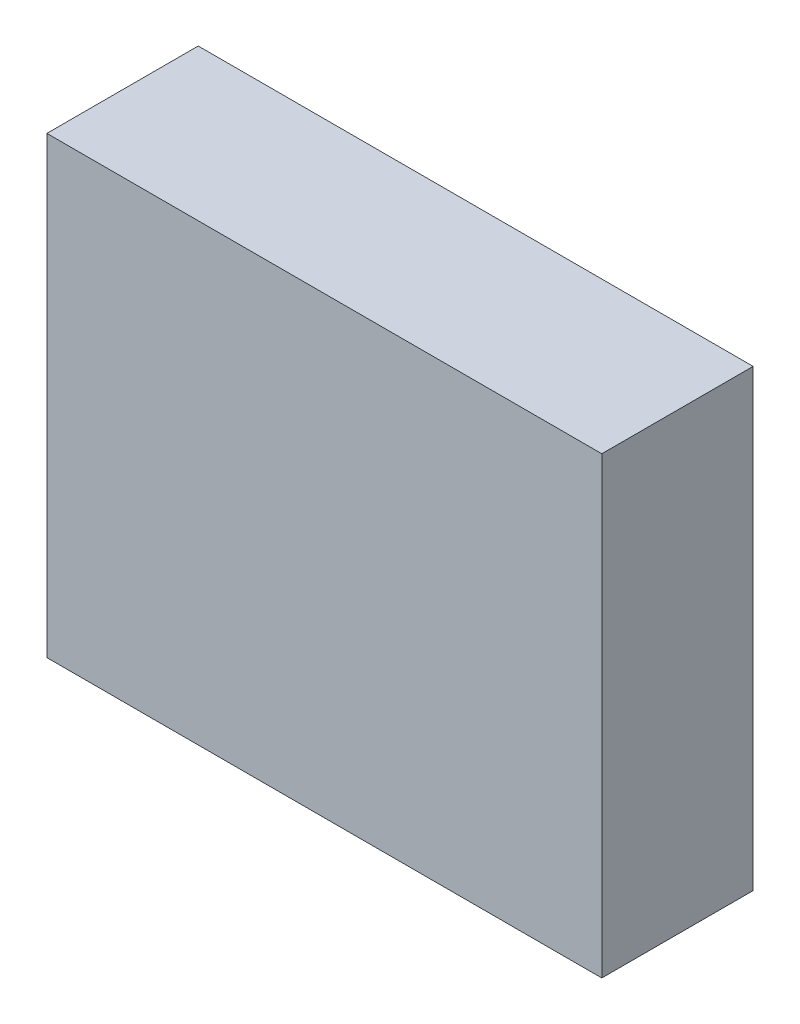
ISO-10303-21;
HEADER;
FILE_DESCRIPTION(('STEP AP214'),'2;1');
FILE_NAME('part.step','',(''),(''),'','','');
FILE_SCHEMA(('AUTOMOTIVE_DESIGN { 1 0 10303 214 1 1 1 1 }'));
ENDSEC;
DATA;
#1=APPLICATION_CONTEXT('core data for automotive mechanical design processes');
#2=APPLICATION_PROTOCOL_DEFINITION('international standard','automotive_design',2000,#1);
#3=PRODUCT_CONTEXT('',#1,'mechanical');
#4=PRODUCT('Part','Part','',(#3));
#5=PRODUCT_RELATED_PRODUCT_CATEGORY('part','',(#4));
#6=PRODUCT_DEFINITION_FORMATION('','',#4);
#7=PRODUCT_DEFINITION_CONTEXT('part definition',#1,'design');
#8=PRODUCT_DEFINITION('design','',#6,#7);
#9=PRODUCT_DEFINITION_SHAPE('','',#8);
#10=(LENGTH_UNIT() NAMED_UNIT(*) SI_UNIT(.MILLI.,.METRE.));
#11=(NAMED_UNIT(*) PLANE_ANGLE_UNIT() SI_UNIT($,.RADIAN.));
#12=(NAMED_UNIT(*) SI_UNIT($,.STERADIAN.) SOLID_ANGLE_UNIT());
#13=UNCERTAINTY_MEASURE_WITH_UNIT(LENGTH_MEASURE(1.E-05),#10,'distance_accuracy_value','');
#14=(GEOMETRIC_REPRESENTATION_CONTEXT(3) GLOBAL_UNCERTAINTY_ASSIGNED_CONTEXT((#13)) GLOBAL_UNIT_ASSIGNED_CONTEXT((#10,
#11,#12)) REPRESENTATION_CONTEXT('',''));
#15=CARTESIAN_POINT('',(0.,0.,0.));
#16=DIRECTION('',(0.,0.,1.));
#17=DIRECTION('',(1.,0.,0.));
#18=AXIS2_PLACEMENT_3D('',#15,#16,#17);
#19=CARTESIAN_POINT('',(990.,1690.,-700.));
#20=DIRECTION('',(-1.,0.,0.));
#21=DIRECTION('',(0.,0.,1.));
#22=AXIS2_PLACEMENT_3D('',#19,#20,#21);
#23=PLANE('',#22);
#24=DIRECTION('',(0.,-1.,0.));
#25=VECTOR('',#24,1.);
#26=CARTESIAN_POINT('',(990.,1690.,-670.));
#27=LINE('',#26,#25);
#28=CARTESIAN_POINT('',(990.,1780.,-670.));
#29=VERTEX_POINT('',#28);
#30=CARTESIAN_POINT('',(990.,1690.,-670.));
#31=VERTEX_POINT('',#30);
#32=EDGE_CURVE('E103',#29,#31,#27,.T.);
#33=ORIENTED_EDGE('',*,*,#32,.F.);
#34=DIRECTION('',(0.,0.,1.));
#35=VECTOR('',#34,1.);
#36=CARTESIAN_POINT('',(990.,1780.,-700.));
#37=LINE('',#36,#35);
#38=CARTESIAN_POINT('',(990.,1780.,-700.));
#39=VERTEX_POINT('',#38);
#40=EDGE_CURVE('E11',#39,#29,#37,.T.);
#41=ORIENTED_EDGE('',*,*,#40,.F.);
#42=DIRECTION('',(0.,-1.,0.));
#43=VECTOR('',#42,1.);
#44=CARTESIAN_POINT('',(990.,1690.,-700.));
#45=LINE('',#44,#43);
#46=CARTESIAN_POINT('',(990.,1690.,-700.));
#47=VERTEX_POINT('',#46);
#48=EDGE_CURVE('E97',#39,#47,#45,.T.);
#49=ORIENTED_EDGE('',*,*,#48,.T.);
#50=DIRECTION('',(0.,0.,1.));
#51=VECTOR('',#50,1.);
#52=CARTESIAN_POINT('',(990.,1690.,-700.));
#53=LINE('',#52,#51);
#54=EDGE_CURVE('E42',#47,#31,#53,.T.);
#55=ORIENTED_EDGE('',*,*,#54,.T.);
#56=EDGE_LOOP('',(#33,#41,#49,#55));
#57=FACE_BOUND('',#56,.T.);
#58=ADVANCED_FACE('F39',(#57),#23,.T.);
#59=CARTESIAN_POINT('',(990.,1780.,-700.));
#60=DIRECTION('',(0.,1.,0.));
#61=DIRECTION('',(0.,0.,1.));
#62=AXIS2_PLACEMENT_3D('',#59,#60,#61);
#63=PLANE('',#62);
#64=DIRECTION('',(-1.,0.,0.));
#65=VECTOR('',#64,1.);
#66=CARTESIAN_POINT('',(990.,1780.,-670.));
#67=LINE('',#66,#65);
#68=CARTESIAN_POINT('',(1100.,1780.,-670.));
#69=VERTEX_POINT('',#68);
#70=EDGE_CURVE('E99',#69,#29,#67,.T.);
#71=ORIENTED_EDGE('',*,*,#70,.F.);
#72=DIRECTION('',(0.,0.,1.));
#73=VECTOR('',#72,1.);
#74=CARTESIAN_POINT('',(1100.,1780.,-700.));
#75=LINE('',#74,#73);
#76=CARTESIAN_POINT('',(1100.,1780.,-700.));
#77=VERTEX_POINT('',#76);
#78=EDGE_CURVE('E48',#77,#69,#75,.T.);
#79=ORIENTED_EDGE('',*,*,#78,.F.);
#80=DIRECTION('',(-1.,0.,0.));
#81=VECTOR('',#80,1.);
#82=CARTESIAN_POINT('',(990.,1780.,-700.));
#83=LINE('',#82,#81);
#84=EDGE_CURVE('E94',#77,#39,#83,.T.);
#85=ORIENTED_EDGE('',*,*,#84,.T.);
#86=ORIENTED_EDGE('',*,*,#40,.T.);
#87=EDGE_LOOP('',(#71,#79,#85,#86));
#88=FACE_BOUND('',#87,.T.);
#89=ADVANCED_FACE('F113',(#88),#63,.T.);
#90=CARTESIAN_POINT('',(1100.,1690.,-700.));
#91=DIRECTION('',(1.,0.,0.));
#92=DIRECTION('',(0.,0.,-1.));
#93=AXIS2_PLACEMENT_3D('',#90,#91,#92);
#94=PLANE('',#93);
#95=DIRECTION('',(0.,1.,0.));
#96=VECTOR('',#95,1.);
#97=CARTESIAN_POINT('',(1100.,1690.,-670.));
#98=LINE('',#97,#96);
#99=CARTESIAN_POINT('',(1100.,1690.,-670.));
#100=VERTEX_POINT('',#99);
#101=EDGE_CURVE('E89',#100,#69,#98,.T.);
#102=ORIENTED_EDGE('',*,*,#101,.F.);
#103=DIRECTION('',(0.,0.,1.));
#104=VECTOR('',#103,1.);
#105=CARTESIAN_POINT('',(1100.,1690.,-700.));
#106=LINE('',#105,#104);
#107=CARTESIAN_POINT('',(1100.,1690.,-700.));
#108=VERTEX_POINT('',#107);
#109=EDGE_CURVE('E84',#108,#100,#106,.T.);
#110=ORIENTED_EDGE('',*,*,#109,.F.);
#111=DIRECTION('',(0.,1.,0.));
#112=VECTOR('',#111,1.);
#113=CARTESIAN_POINT('',(1100.,1690.,-700.));
#114=LINE('',#113,#112);
#115=EDGE_CURVE('E87',#108,#77,#114,.T.);
#116=ORIENTED_EDGE('',*,*,#115,.T.);
#117=ORIENTED_EDGE('',*,*,#78,.T.);
#118=EDGE_LOOP('',(#102,#110,#116,#117));
#119=FACE_BOUND('',#118,.T.);
#120=ADVANCED_FACE('F86',(#119),#94,.T.);
#121=CARTESIAN_POINT('',(990.,1690.,-700.));
#122=DIRECTION('',(0.,-1.,0.));
#123=DIRECTION('',(0.,0.,-1.));
#124=AXIS2_PLACEMENT_3D('',#121,#122,#123);
#125=PLANE('',#124);
#126=DIRECTION('',(1.,0.,0.));
#127=VECTOR('',#126,1.);
#128=CARTESIAN_POINT('',(990.,1690.,-670.));
#129=LINE('',#128,#127);
#130=EDGE_CURVE('E106',#31,#100,#129,.T.);
#131=ORIENTED_EDGE('',*,*,#130,.F.);
#132=ORIENTED_EDGE('',*,*,#54,.F.);
#133=DIRECTION('',(1.,0.,0.));
#134=VECTOR('',#133,1.);
#135=CARTESIAN_POINT('',(990.,1690.,-700.));
#136=LINE('',#135,#134);
#137=EDGE_CURVE('E93',#47,#108,#136,.T.);
#138=ORIENTED_EDGE('',*,*,#137,.T.);
#139=ORIENTED_EDGE('',*,*,#109,.T.);
#140=EDGE_LOOP('',(#131,#132,#138,#139));
#141=FACE_BOUND('',#140,.T.);
#142=ADVANCED_FACE('F96',(#141),#125,.T.);
#143=CARTESIAN_POINT('',(0.,0.,-700.));
#144=DIRECTION('',(0.,0.,-1.));
#145=DIRECTION('',(-1.,0.,0.));
#146=AXIS2_PLACEMENT_3D('',#143,#144,#145);
#147=PLANE('',#146);
#148=ORIENTED_EDGE('',*,*,#48,.F.);
#149=ORIENTED_EDGE('',*,*,#84,.F.);
#150=ORIENTED_EDGE('',*,*,#115,.F.);
#151=ORIENTED_EDGE('',*,*,#137,.F.);
#152=EDGE_LOOP('',(#148,#149,#150,#151));
#153=FACE_BOUND('',#152,.T.);
#154=ADVANCED_FACE('F92',(#153),#147,.T.);
#155=CARTESIAN_POINT('',(0.,0.,-670.));
#156=DIRECTION('',(0.,0.,-1.));
#157=DIRECTION('',(-1.,0.,0.));
#158=AXIS2_PLACEMENT_3D('',#155,#156,#157);
#159=PLANE('',#158);
#160=ORIENTED_EDGE('',*,*,#32,.T.);
#161=ORIENTED_EDGE('',*,*,#130,.T.);
#162=ORIENTED_EDGE('',*,*,#101,.T.);
#163=ORIENTED_EDGE('',*,*,#70,.T.);
#164=EDGE_LOOP('',(#160,#161,#162,#163));
#165=FACE_BOUND('',#164,.T.);
#166=ADVANCED_FACE('F112',(#165),#159,.F.);
#167=CLOSED_SHELL('',(#58,#89,#120,#142,#154,#166));
#168=MANIFOLD_SOLID_BREP('B2',#167);
#169=ADVANCED_BREP_SHAPE_REPRESENTATION('',(#18,#168),#14);
#170=SHAPE_DEFINITION_REPRESENTATION(#9,#169);
ENDSEC;
END-ISO-10303-21;
